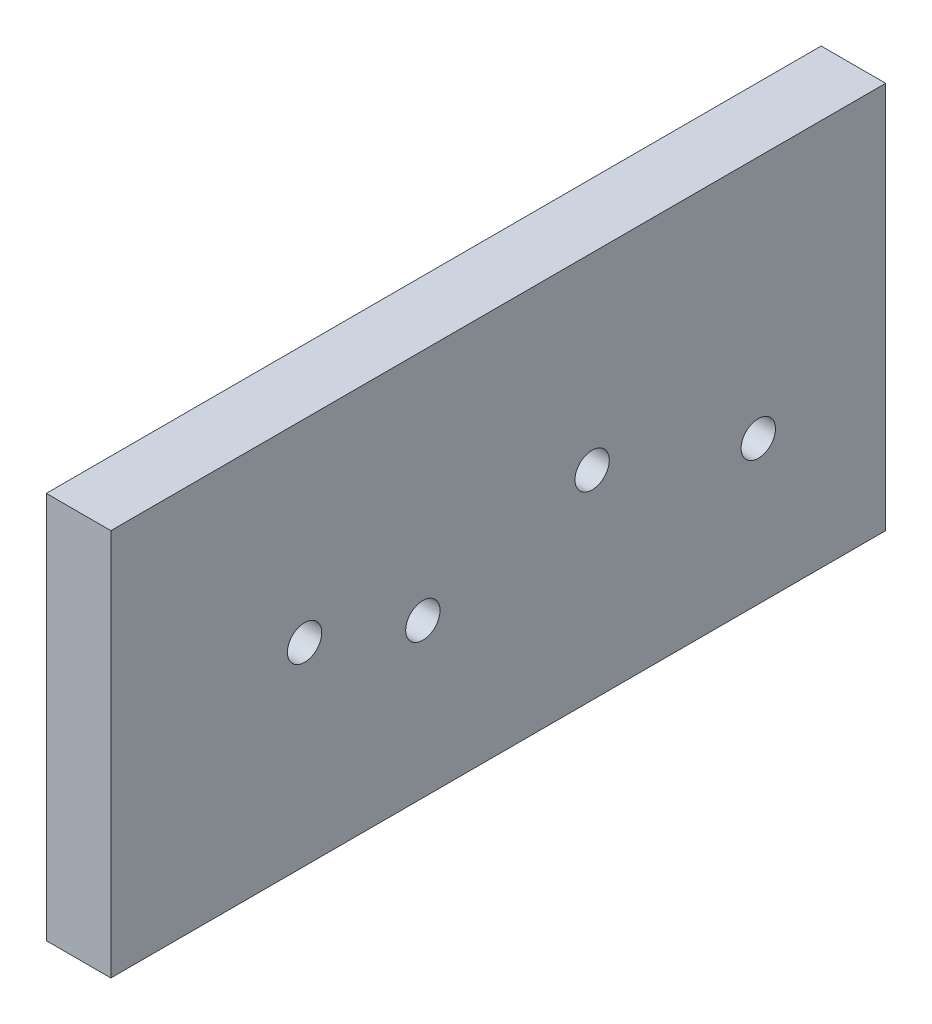
ISO-10303-21;
HEADER;
FILE_DESCRIPTION(('STEP AP214'),'2;1');
FILE_NAME('part.step','',(''),(''),'','','');
FILE_SCHEMA(('AUTOMOTIVE_DESIGN { 1 0 10303 214 1 1 1 1 }'));
ENDSEC;
DATA;
#1=APPLICATION_CONTEXT('core data for automotive mechanical design processes');
#2=APPLICATION_PROTOCOL_DEFINITION('international standard','automotive_design',2000,#1);
#3=PRODUCT_CONTEXT('',#1,'mechanical');
#4=PRODUCT('Part','Part','',(#3));
#5=PRODUCT_RELATED_PRODUCT_CATEGORY('part','',(#4));
#6=PRODUCT_DEFINITION_FORMATION('','',#4);
#7=PRODUCT_DEFINITION_CONTEXT('part definition',#1,'design');
#8=PRODUCT_DEFINITION('design','',#6,#7);
#9=PRODUCT_DEFINITION_SHAPE('','',#8);
#10=(LENGTH_UNIT() NAMED_UNIT(*) SI_UNIT(.MILLI.,.METRE.));
#11=(NAMED_UNIT(*) PLANE_ANGLE_UNIT() SI_UNIT($,.RADIAN.));
#12=(NAMED_UNIT(*) SI_UNIT($,.STERADIAN.) SOLID_ANGLE_UNIT());
#13=UNCERTAINTY_MEASURE_WITH_UNIT(LENGTH_MEASURE(1.E-05),#10,'distance_accuracy_value','');
#14=(GEOMETRIC_REPRESENTATION_CONTEXT(3) GLOBAL_UNCERTAINTY_ASSIGNED_CONTEXT((#13)) GLOBAL_UNIT_ASSIGNED_CONTEXT((#10,
#11,#12)) REPRESENTATION_CONTEXT('',''));
#15=CARTESIAN_POINT('',(0.,0.,0.));
#16=DIRECTION('',(0.,0.,1.));
#17=DIRECTION('',(1.,0.,0.));
#18=AXIS2_PLACEMENT_3D('',#15,#16,#17);
#19=CARTESIAN_POINT('',(12.7,-9.873506971,-51.1434579937716));
#20=DIRECTION('',(-1.,0.,0.));
#21=DIRECTION('',(0.,0.,1.));
#22=AXIS2_PLACEMENT_3D('',#19,#20,#21);
#23=CYLINDRICAL_SURFACE('',#22,3.3782);
#24=CARTESIAN_POINT('',(12.7,-9.873506971,-51.1434579937716));
#25=DIRECTION('',(1.,0.,0.));
#26=DIRECTION('',(0.,0.,-1.));
#27=AXIS2_PLACEMENT_3D('',#24,#25,#26);
#28=CIRCLE('',#27,3.3782);
#29=CARTESIAN_POINT('',(12.7,-9.873506971,-54.5216579937716));
#30=VERTEX_POINT('',#29);
#31=EDGE_CURVE('E115',#30,#30,#28,.T.);
#32=ORIENTED_EDGE('',*,*,#31,.T.);
#33=EDGE_LOOP('',(#32));
#34=FACE_BOUND('',#33,.T.);
#35=CARTESIAN_POINT('',(4.7625,-9.873506971,-51.1434579937716));
#36=DIRECTION('',(-1.,0.,0.));
#37=DIRECTION('',(0.,0.,1.));
#38=AXIS2_PLACEMENT_3D('',#35,#36,#37);
#39=CIRCLE('',#38,3.3782);
#40=CARTESIAN_POINT('',(4.7625,-9.873506971,-47.7652579937716));
#41=VERTEX_POINT('',#40);
#42=EDGE_CURVE('E45',#41,#41,#39,.T.);
#43=ORIENTED_EDGE('',*,*,#42,.T.);
#44=EDGE_LOOP('',(#43));
#45=FACE_BOUND('',#44,.T.);
#46=ADVANCED_FACE('F41',(#34,#45),#23,.F.);
#47=CARTESIAN_POINT('',(12.7,1.096077429,-18.4577335821185));
#48=DIRECTION('',(-1.,0.,0.));
#49=DIRECTION('',(0.,0.,1.));
#50=AXIS2_PLACEMENT_3D('',#47,#48,#49);
#51=CYLINDRICAL_SURFACE('',#50,3.3782);
#52=CARTESIAN_POINT('',(12.7,1.096077429,-18.4577335821185));
#53=DIRECTION('',(1.,0.,0.));
#54=DIRECTION('',(0.,0.,-1.));
#55=AXIS2_PLACEMENT_3D('',#52,#53,#54);
#56=CIRCLE('',#55,3.3782);
#57=CARTESIAN_POINT('',(12.7,1.096077429,-21.8359335821185));
#58=VERTEX_POINT('',#57);
#59=EDGE_CURVE('E112',#58,#58,#56,.T.);
#60=ORIENTED_EDGE('',*,*,#59,.T.);
#61=EDGE_LOOP('',(#60));
#62=FACE_BOUND('',#61,.T.);
#63=CARTESIAN_POINT('',(4.7625,1.096077429,-18.4577335821185));
#64=DIRECTION('',(-1.,0.,0.));
#65=DIRECTION('',(0.,0.,1.));
#66=AXIS2_PLACEMENT_3D('',#63,#64,#65);
#67=CIRCLE('',#66,3.3782);
#68=CARTESIAN_POINT('',(4.7625,1.096077429,-15.0795335821185));
#69=VERTEX_POINT('',#68);
#70=EDGE_CURVE('E137',#69,#69,#67,.T.);
#71=ORIENTED_EDGE('',*,*,#70,.T.);
#72=EDGE_LOOP('',(#71));
#73=FACE_BOUND('',#72,.T.);
#74=ADVANCED_FACE('F208',(#62,#73),#51,.F.);
#75=CARTESIAN_POINT('',(12.7,0.,38.1));
#76=DIRECTION('',(-1.,0.,0.));
#77=DIRECTION('',(0.,0.,1.));
#78=AXIS2_PLACEMENT_3D('',#75,#76,#77);
#79=CYLINDRICAL_SURFACE('',#78,3.3782);
#80=CARTESIAN_POINT('',(12.7,0.,38.1));
#81=DIRECTION('',(1.,0.,0.));
#82=DIRECTION('',(0.,0.,-1.));
#83=AXIS2_PLACEMENT_3D('',#80,#81,#82);
#84=CIRCLE('',#83,3.3782);
#85=CARTESIAN_POINT('',(12.7,0.,34.7218));
#86=VERTEX_POINT('',#85);
#87=EDGE_CURVE('E106',#86,#86,#84,.T.);
#88=ORIENTED_EDGE('',*,*,#87,.T.);
#89=EDGE_LOOP('',(#88));
#90=FACE_BOUND('',#89,.T.);
#91=CARTESIAN_POINT('',(4.7625,0.,38.1));
#92=DIRECTION('',(-1.,0.,0.));
#93=DIRECTION('',(0.,0.,1.));
#94=AXIS2_PLACEMENT_3D('',#91,#92,#93);
#95=CIRCLE('',#94,3.3782);
#96=CARTESIAN_POINT('',(4.7625,0.,41.4782));
#97=VERTEX_POINT('',#96);
#98=EDGE_CURVE('E134',#97,#97,#95,.T.);
#99=ORIENTED_EDGE('',*,*,#98,.T.);
#100=EDGE_LOOP('',(#99));
#101=FACE_BOUND('',#100,.T.);
#102=ADVANCED_FACE('F214',(#90,#101),#79,.F.);
#103=CARTESIAN_POINT('',(12.7,-7.860160654,14.8360220129459));
#104=DIRECTION('',(-1.,0.,0.));
#105=DIRECTION('',(0.,0.,1.));
#106=AXIS2_PLACEMENT_3D('',#103,#104,#105);
#107=CYLINDRICAL_SURFACE('',#106,3.3782);
#108=CARTESIAN_POINT('',(12.7,-7.860160654,14.8360220129459));
#109=DIRECTION('',(1.,0.,0.));
#110=DIRECTION('',(0.,0.,-1.));
#111=AXIS2_PLACEMENT_3D('',#108,#109,#110);
#112=CIRCLE('',#111,3.3782);
#113=CARTESIAN_POINT('',(12.7,-7.860160654,11.4578220129459));
#114=VERTEX_POINT('',#113);
#115=EDGE_CURVE('E118',#114,#114,#112,.T.);
#116=ORIENTED_EDGE('',*,*,#115,.T.);
#117=EDGE_LOOP('',(#116));
#118=FACE_BOUND('',#117,.T.);
#119=CARTESIAN_POINT('',(4.7625,-7.860160654,14.8360220129459));
#120=DIRECTION('',(-1.,0.,0.));
#121=DIRECTION('',(0.,0.,1.));
#122=AXIS2_PLACEMENT_3D('',#119,#120,#121);
#123=CIRCLE('',#122,3.3782);
#124=CARTESIAN_POINT('',(4.7625,-7.860160654,18.2142220129459));
#125=VERTEX_POINT('',#124);
#126=EDGE_CURVE('E131',#125,#125,#123,.T.);
#127=ORIENTED_EDGE('',*,*,#126,.T.);
#128=EDGE_LOOP('',(#127));
#129=FACE_BOUND('',#128,.T.);
#130=ADVANCED_FACE('F218',(#118,#129),#107,.F.);
#131=CARTESIAN_POINT('',(12.7,-38.1,0.));
#132=DIRECTION('',(0.,1.,0.));
#133=DIRECTION('',(0.,0.,1.));
#134=AXIS2_PLACEMENT_3D('',#131,#132,#133);
#135=PLANE('',#134);
#136=DIRECTION('',(0.,0.,-1.));
#137=VECTOR('',#136,1.);
#138=CARTESIAN_POINT('',(0.,-38.1,0.));
#139=LINE('',#138,#137);
#140=CARTESIAN_POINT('',(0.,-38.1,76.2));
#141=VERTEX_POINT('',#140);
#142=CARTESIAN_POINT('',(0.,-38.1,-76.2));
#143=VERTEX_POINT('',#142);
#144=EDGE_CURVE('E121',#141,#143,#139,.T.);
#145=ORIENTED_EDGE('',*,*,#144,.T.);
#146=DIRECTION('',(-1.,0.,0.));
#147=VECTOR('',#146,1.);
#148=CARTESIAN_POINT('',(12.7,-38.1,-76.2));
#149=LINE('',#148,#147);
#150=CARTESIAN_POINT('',(12.7,-38.1,-76.2));
#151=VERTEX_POINT('',#150);
#152=EDGE_CURVE('E11',#151,#143,#149,.T.);
#153=ORIENTED_EDGE('',*,*,#152,.F.);
#154=DIRECTION('',(0.,0.,-1.));
#155=VECTOR('',#154,1.);
#156=CARTESIAN_POINT('',(12.7,-38.1,0.));
#157=LINE('',#156,#155);
#158=CARTESIAN_POINT('',(12.7,-38.1,76.2));
#159=VERTEX_POINT('',#158);
#160=EDGE_CURVE('E94',#159,#151,#157,.T.);
#161=ORIENTED_EDGE('',*,*,#160,.F.);
#162=DIRECTION('',(-1.,0.,0.));
#163=VECTOR('',#162,1.);
#164=CARTESIAN_POINT('',(12.7,-38.1,76.2));
#165=LINE('',#164,#163);
#166=EDGE_CURVE('E60',#159,#141,#165,.T.);
#167=ORIENTED_EDGE('',*,*,#166,.T.);
#168=EDGE_LOOP('',(#145,#153,#161,#167));
#169=FACE_BOUND('',#168,.T.);
#170=ADVANCED_FACE('F43',(#169),#135,.F.);
#171=CARTESIAN_POINT('',(12.7,0.,-76.2));
#172=DIRECTION('',(0.,0.,1.));
#173=DIRECTION('',(1.,0.,0.));
#174=AXIS2_PLACEMENT_3D('',#171,#172,#173);
#175=PLANE('',#174);
#176=DIRECTION('',(0.,1.,0.));
#177=VECTOR('',#176,1.);
#178=CARTESIAN_POINT('',(0.,0.,-76.2));
#179=LINE('',#178,#177);
#180=CARTESIAN_POINT('',(0.,38.1,-76.2));
#181=VERTEX_POINT('',#180);
#182=EDGE_CURVE('E99',#143,#181,#179,.T.);
#183=ORIENTED_EDGE('',*,*,#182,.T.);
#184=DIRECTION('',(-1.,0.,0.));
#185=VECTOR('',#184,1.);
#186=CARTESIAN_POINT('',(12.7,38.1,-76.2));
#187=LINE('',#186,#185);
#188=CARTESIAN_POINT('',(12.7,38.1,-76.2));
#189=VERTEX_POINT('',#188);
#190=EDGE_CURVE('E51',#189,#181,#187,.T.);
#191=ORIENTED_EDGE('',*,*,#190,.F.);
#192=DIRECTION('',(0.,1.,0.));
#193=VECTOR('',#192,1.);
#194=CARTESIAN_POINT('',(12.7,0.,-76.2));
#195=LINE('',#194,#193);
#196=EDGE_CURVE('E85',#151,#189,#195,.T.);
#197=ORIENTED_EDGE('',*,*,#196,.F.);
#198=ORIENTED_EDGE('',*,*,#152,.T.);
#199=EDGE_LOOP('',(#183,#191,#197,#198));
#200=FACE_BOUND('',#199,.T.);
#201=ADVANCED_FACE('F98',(#200),#175,.F.);
#202=CARTESIAN_POINT('',(12.7,38.1,0.));
#203=DIRECTION('',(0.,1.,0.));
#204=DIRECTION('',(0.,0.,1.));
#205=AXIS2_PLACEMENT_3D('',#202,#203,#204);
#206=PLANE('',#205);
#207=DIRECTION('',(0.,0.,-1.));
#208=VECTOR('',#207,1.);
#209=CARTESIAN_POINT('',(0.,38.1,0.));
#210=LINE('',#209,#208);
#211=CARTESIAN_POINT('',(0.,38.1,76.2));
#212=VERTEX_POINT('',#211);
#213=EDGE_CURVE('E124',#212,#181,#210,.T.);
#214=ORIENTED_EDGE('',*,*,#213,.F.);
#215=DIRECTION('',(-1.,0.,0.));
#216=VECTOR('',#215,1.);
#217=CARTESIAN_POINT('',(12.7,38.1,76.2));
#218=LINE('',#217,#216);
#219=CARTESIAN_POINT('',(12.7,38.1,76.2));
#220=VERTEX_POINT('',#219);
#221=EDGE_CURVE('E74',#220,#212,#218,.T.);
#222=ORIENTED_EDGE('',*,*,#221,.F.);
#223=DIRECTION('',(0.,0.,-1.));
#224=VECTOR('',#223,1.);
#225=CARTESIAN_POINT('',(12.7,38.1,0.));
#226=LINE('',#225,#224);
#227=EDGE_CURVE('E93',#220,#189,#226,.T.);
#228=ORIENTED_EDGE('',*,*,#227,.T.);
#229=ORIENTED_EDGE('',*,*,#190,.T.);
#230=EDGE_LOOP('',(#214,#222,#228,#229));
#231=FACE_BOUND('',#230,.T.);
#232=ADVANCED_FACE('F103',(#231),#206,.T.);
#233=CARTESIAN_POINT('',(12.7,0.,76.2));
#234=DIRECTION('',(0.,0.,1.));
#235=DIRECTION('',(1.,0.,0.));
#236=AXIS2_PLACEMENT_3D('',#233,#234,#235);
#237=PLANE('',#236);
#238=DIRECTION('',(0.,1.,0.));
#239=VECTOR('',#238,1.);
#240=CARTESIAN_POINT('',(0.,0.,76.2));
#241=LINE('',#240,#239);
#242=EDGE_CURVE('E126',#141,#212,#241,.T.);
#243=ORIENTED_EDGE('',*,*,#242,.F.);
#244=ORIENTED_EDGE('',*,*,#166,.F.);
#245=DIRECTION('',(0.,1.,0.));
#246=VECTOR('',#245,1.);
#247=CARTESIAN_POINT('',(12.7,0.,76.2));
#248=LINE('',#247,#246);
#249=EDGE_CURVE('E104',#159,#220,#248,.T.);
#250=ORIENTED_EDGE('',*,*,#249,.T.);
#251=ORIENTED_EDGE('',*,*,#221,.T.);
#252=EDGE_LOOP('',(#243,#244,#250,#251));
#253=FACE_BOUND('',#252,.T.);
#254=ADVANCED_FACE('F197',(#253),#237,.T.);
#255=CARTESIAN_POINT('',(12.7,0.,0.));
#256=DIRECTION('',(1.,0.,0.));
#257=DIRECTION('',(0.,0.,-1.));
#258=AXIS2_PLACEMENT_3D('',#255,#256,#257);
#259=PLANE('',#258);
#260=ORIENTED_EDGE('',*,*,#160,.T.);
#261=ORIENTED_EDGE('',*,*,#196,.T.);
#262=ORIENTED_EDGE('',*,*,#227,.F.);
#263=ORIENTED_EDGE('',*,*,#249,.F.);
#264=EDGE_LOOP('',(#260,#261,#262,#263));
#265=FACE_BOUND('',#264,.T.);
#266=ORIENTED_EDGE('',*,*,#87,.F.);
#267=EDGE_LOOP('',(#266));
#268=FACE_BOUND('',#267,.T.);
#269=ORIENTED_EDGE('',*,*,#59,.F.);
#270=EDGE_LOOP('',(#269));
#271=FACE_BOUND('',#270,.T.);
#272=ORIENTED_EDGE('',*,*,#31,.F.);
#273=EDGE_LOOP('',(#272));
#274=FACE_BOUND('',#273,.T.);
#275=ORIENTED_EDGE('',*,*,#115,.F.);
#276=EDGE_LOOP('',(#275));
#277=FACE_BOUND('',#276,.T.);
#278=ADVANCED_FACE('F89',(#265,#268,#271,#274,#277),#259,.T.);
#279=CARTESIAN_POINT('',(0.,0.,0.));
#280=DIRECTION('',(1.,0.,0.));
#281=DIRECTION('',(0.,0.,-1.));
#282=AXIS2_PLACEMENT_3D('',#279,#280,#281);
#283=PLANE('',#282);
#284=CARTESIAN_POINT('',(0.,0.,38.1));
#285=DIRECTION('',(-1.,0.,0.));
#286=DIRECTION('',(0.,0.,1.));
#287=AXIS2_PLACEMENT_3D('',#284,#285,#286);
#288=CIRCLE('',#287,6.223);
#289=CARTESIAN_POINT('',(0.,0.,44.323));
#290=VERTEX_POINT('',#289);
#291=EDGE_CURVE('E172',#290,#290,#288,.T.);
#292=ORIENTED_EDGE('',*,*,#291,.F.);
#293=EDGE_LOOP('',(#292));
#294=FACE_BOUND('',#293,.T.);
#295=CARTESIAN_POINT('',(0.,-7.860160654,14.8360220129459));
#296=DIRECTION('',(-1.,0.,0.));
#297=DIRECTION('',(0.,0.,1.));
#298=AXIS2_PLACEMENT_3D('',#295,#296,#297);
#299=CIRCLE('',#298,6.223);
#300=CARTESIAN_POINT('',(0.,-7.860160654,21.0590220129459));
#301=VERTEX_POINT('',#300);
#302=EDGE_CURVE('E169',#301,#301,#299,.T.);
#303=ORIENTED_EDGE('',*,*,#302,.F.);
#304=EDGE_LOOP('',(#303));
#305=FACE_BOUND('',#304,.T.);
#306=CARTESIAN_POINT('',(0.,1.096077429,-18.4577335821185));
#307=DIRECTION('',(-1.,0.,0.));
#308=DIRECTION('',(0.,0.,1.));
#309=AXIS2_PLACEMENT_3D('',#306,#307,#308);
#310=CIRCLE('',#309,6.223);
#311=CARTESIAN_POINT('',(0.,1.096077429,-12.2347335821185));
#312=VERTEX_POINT('',#311);
#313=EDGE_CURVE('E163',#312,#312,#310,.T.);
#314=ORIENTED_EDGE('',*,*,#313,.F.);
#315=EDGE_LOOP('',(#314));
#316=FACE_BOUND('',#315,.T.);
#317=CARTESIAN_POINT('',(0.,-9.873506971,-51.1434579937716));
#318=DIRECTION('',(-1.,0.,0.));
#319=DIRECTION('',(0.,0.,1.));
#320=AXIS2_PLACEMENT_3D('',#317,#318,#319);
#321=CIRCLE('',#320,6.223);
#322=CARTESIAN_POINT('',(0.,-9.873506971,-44.9204579937716));
#323=VERTEX_POINT('',#322);
#324=EDGE_CURVE('E155',#323,#323,#321,.T.);
#325=ORIENTED_EDGE('',*,*,#324,.F.);
#326=EDGE_LOOP('',(#325));
#327=FACE_BOUND('',#326,.T.);
#328=ORIENTED_EDGE('',*,*,#144,.F.);
#329=ORIENTED_EDGE('',*,*,#242,.T.);
#330=ORIENTED_EDGE('',*,*,#213,.T.);
#331=ORIENTED_EDGE('',*,*,#182,.F.);
#332=EDGE_LOOP('',(#328,#329,#330,#331));
#333=FACE_BOUND('',#332,.T.);
#334=ADVANCED_FACE('F187',(#294,#305,#316,#327,#333),#283,.F.);
#335=CARTESIAN_POINT('',(4.7625,-9.873506971,-51.1434579937716));
#336=DIRECTION('',(-1.,0.,0.));
#337=DIRECTION('',(0.,0.,1.));
#338=AXIS2_PLACEMENT_3D('',#335,#336,#337);
#339=CYLINDRICAL_SURFACE('',#338,6.223);
#340=CARTESIAN_POINT('',(4.7625,-9.873506971,-51.1434579937716));
#341=DIRECTION('',(-1.,0.,0.));
#342=DIRECTION('',(0.,0.,1.));
#343=AXIS2_PLACEMENT_3D('',#340,#341,#342);
#344=CIRCLE('',#343,6.223);
#345=CARTESIAN_POINT('',(4.7625,-9.873506971,-44.9204579937716));
#346=VERTEX_POINT('',#345);
#347=EDGE_CURVE('E153',#346,#346,#344,.T.);
#348=CARTESIAN_POINT('',(4.7625,-9.873506971,-44.9204579937716));
#349=CARTESIAN_POINT('',(4.712890625,-9.873506971,-44.9204579937716));
#350=CARTESIAN_POINT('',(4.66328125,-9.873506971,-44.9204579937716));
#351=CARTESIAN_POINT('',(4.5640625,-9.873506971,-44.9204579937716));
#352=CARTESIAN_POINT('',(4.514453125,-9.873506971,-44.9204579937716));
#353=CARTESIAN_POINT('',(4.415234375,-9.873506971,-44.9204579937716));
#354=CARTESIAN_POINT('',(4.365625,-9.873506971,-44.9204579937716));
#355=CARTESIAN_POINT('',(4.26640625,-9.873506971,-44.9204579937716));
#356=CARTESIAN_POINT('',(4.216796875,-9.873506971,-44.9204579937716));
#357=CARTESIAN_POINT('',(4.117578125,-9.873506971,-44.9204579937716));
#358=CARTESIAN_POINT('',(4.06796875,-9.873506971,-44.9204579937716));
#359=CARTESIAN_POINT('',(3.96875,-9.873506971,-44.9204579937716));
#360=CARTESIAN_POINT('',(3.919140625,-9.873506971,-44.9204579937716));
#361=CARTESIAN_POINT('',(3.819921875,-9.873506971,-44.9204579937716));
#362=CARTESIAN_POINT('',(3.7703125,-9.873506971,-44.9204579937716));
#363=CARTESIAN_POINT('',(3.67109375,-9.873506971,-44.9204579937716));
#364=CARTESIAN_POINT('',(3.621484375,-9.873506971,-44.9204579937716));
#365=CARTESIAN_POINT('',(3.522265625,-9.873506971,-44.9204579937716));
#366=CARTESIAN_POINT('',(3.47265625,-9.873506971,-44.9204579937716));
#367=CARTESIAN_POINT('',(3.3734375,-9.873506971,-44.9204579937716));
#368=CARTESIAN_POINT('',(3.323828125,-9.873506971,-44.9204579937716));
#369=CARTESIAN_POINT('',(3.224609375,-9.873506971,-44.9204579937716));
#370=CARTESIAN_POINT('',(3.175,-9.873506971,-44.9204579937716));
#371=CARTESIAN_POINT('',(3.07578125,-9.873506971,-44.9204579937716));
#372=CARTESIAN_POINT('',(3.026171875,-9.873506971,-44.9204579937716));
#373=CARTESIAN_POINT('',(2.926953125,-9.873506971,-44.9204579937716));
#374=CARTESIAN_POINT('',(2.87734375,-9.873506971,-44.9204579937716));
#375=CARTESIAN_POINT('',(2.778125,-9.873506971,-44.9204579937716));
#376=CARTESIAN_POINT('',(2.728515625,-9.873506971,-44.9204579937716));
#377=CARTESIAN_POINT('',(2.629296875,-9.873506971,-44.9204579937716));
#378=CARTESIAN_POINT('',(2.5796875,-9.873506971,-44.9204579937716));
#379=CARTESIAN_POINT('',(2.48046875,-9.873506971,-44.9204579937716));
#380=CARTESIAN_POINT('',(2.430859375,-9.873506971,-44.9204579937716));
#381=CARTESIAN_POINT('',(2.331640625,-9.873506971,-44.9204579937716));
#382=CARTESIAN_POINT('',(2.28203125,-9.873506971,-44.9204579937716));
#383=CARTESIAN_POINT('',(2.1828125,-9.873506971,-44.9204579937716));
#384=CARTESIAN_POINT('',(2.133203125,-9.873506971,-44.9204579937716));
#385=CARTESIAN_POINT('',(2.033984375,-9.873506971,-44.9204579937716));
#386=CARTESIAN_POINT('',(1.984375,-9.873506971,-44.9204579937716));
#387=CARTESIAN_POINT('',(1.88515625,-9.873506971,-44.9204579937716));
#388=CARTESIAN_POINT('',(1.835546875,-9.873506971,-44.9204579937716));
#389=CARTESIAN_POINT('',(1.736328125,-9.873506971,-44.9204579937716));
#390=CARTESIAN_POINT('',(1.68671875,-9.873506971,-44.9204579937716));
#391=CARTESIAN_POINT('',(1.5875,-9.873506971,-44.9204579937716));
#392=CARTESIAN_POINT('',(1.537890625,-9.873506971,-44.9204579937716));
#393=CARTESIAN_POINT('',(1.438671875,-9.873506971,-44.9204579937716));
#394=CARTESIAN_POINT('',(1.3890625,-9.873506971,-44.9204579937716));
#395=CARTESIAN_POINT('',(1.28984375,-9.873506971,-44.9204579937716));
#396=CARTESIAN_POINT('',(1.240234375,-9.873506971,-44.9204579937716));
#397=CARTESIAN_POINT('',(1.141015625,-9.873506971,-44.9204579937716));
#398=CARTESIAN_POINT('',(1.09140625,-9.873506971,-44.9204579937716));
#399=CARTESIAN_POINT('',(0.9921875,-9.873506971,-44.9204579937716));
#400=CARTESIAN_POINT('',(0.942578125,-9.873506971,-44.9204579937716));
#401=CARTESIAN_POINT('',(0.843359375,-9.873506971,-44.9204579937716));
#402=CARTESIAN_POINT('',(0.79375,-9.873506971,-44.9204579937716));
#403=CARTESIAN_POINT('',(0.69453125,-9.873506971,-44.9204579937716));
#404=CARTESIAN_POINT('',(0.644921875,-9.873506971,-44.9204579937716));
#405=CARTESIAN_POINT('',(0.545703125,-9.873506971,-44.9204579937716));
#406=CARTESIAN_POINT('',(0.49609375,-9.873506971,-44.9204579937716));
#407=CARTESIAN_POINT('',(0.396875,-9.873506971,-44.9204579937716));
#408=CARTESIAN_POINT('',(0.347265625,-9.873506971,-44.9204579937716));
#409=CARTESIAN_POINT('',(0.248046875,-9.873506971,-44.9204579937716));
#410=CARTESIAN_POINT('',(0.1984375,-9.873506971,-44.9204579937716));
#411=CARTESIAN_POINT('',(0.09921875,-9.873506971,-44.9204579937716));
#412=CARTESIAN_POINT('',(0.049609375,-9.873506971,-44.9204579937716));
#413=CARTESIAN_POINT('',(0.,-9.873506971,-44.9204579937716));
#414=B_SPLINE_CURVE_WITH_KNOTS('',3,(#348,#349,#350,#351,#352,#353,#354,#355,#356,#357,#358,
#359,#360,#361,#362,#363,#364,#365,#366,#367,#368,#369,#370,#371,#372,#373,#374,#375,#376,#377,
#378,#379,#380,#381,#382,#383,#384,#385,#386,#387,#388,#389,#390,#391,#392,#393,#394,#395,#396,
#397,#398,#399,#400,#401,#402,#403,#404,#405,#406,#407,#408,#409,#410,#411,#412,#413),
.UNSPECIFIED.,.F.,.F.,(4,2,2,2,2,2,2,2,2,2,2,2,2,2,2,2,2,2,2,2,2,2,2,2,2,2,2,2,2,2,2,2,4),(0.,
0.148828125,0.29765625,0.446484375,0.5953125,0.744140625,0.892968750000001,1.041796875,1.190625,
1.339453125,1.48828125,1.637109375,1.7859375,1.934765625,2.08359375,2.232421875,2.38125,
2.530078125,2.67890625,2.827734375,2.9765625,3.125390625,3.27421875,3.423046875,3.571875,
3.720703125,3.86953125,4.018359375,4.1671875,4.316015625,4.46484375,4.613671875,4.7625),.UNSPECIFIED.);
#415=EDGE_CURVE('BSEAM149',#346,#323,#414,.T.);
#416=ORIENTED_EDGE('',*,*,#347,.F.);
#417=ORIENTED_EDGE('',*,*,#324,.T.);
#418=ORIENTED_EDGE('',*,*,#415,.T.);
#419=ORIENTED_EDGE('',*,*,#415,.F.);
#420=EDGE_LOOP('',(#416,#418,#417,#419));
#421=FACE_BOUND('',#420,.T.);
#422=ADVANCED_FACE('F149',(#421),#339,.F.);
#423=CARTESIAN_POINT('',(4.7625,-9.873506971,-51.1434579937716));
#424=DIRECTION('',(-1.,0.,0.));
#425=DIRECTION('',(0.,0.,1.));
#426=AXIS2_PLACEMENT_3D('',#423,#424,#425);
#427=PLANE('',#426);
#428=ORIENTED_EDGE('',*,*,#42,.F.);
#429=EDGE_LOOP('',(#428));
#430=FACE_BOUND('',#429,.T.);
#431=ORIENTED_EDGE('',*,*,#347,.T.);
#432=EDGE_LOOP('',(#431));
#433=FACE_BOUND('',#432,.T.);
#434=ADVANCED_FACE('F145',(#430,#433),#427,.T.);
#435=CARTESIAN_POINT('',(4.7625,1.096077429,-18.4577335821185));
#436=DIRECTION('',(-1.,0.,0.));
#437=DIRECTION('',(0.,0.,1.));
#438=AXIS2_PLACEMENT_3D('',#435,#436,#437);
#439=CYLINDRICAL_SURFACE('',#438,6.223);
#440=CARTESIAN_POINT('',(4.7625,1.096077429,-18.4577335821185));
#441=DIRECTION('',(-1.,0.,0.));
#442=DIRECTION('',(0.,0.,1.));
#443=AXIS2_PLACEMENT_3D('',#440,#441,#442);
#444=CIRCLE('',#443,6.223);
#445=CARTESIAN_POINT('',(4.7625,1.096077429,-12.2347335821185));
#446=VERTEX_POINT('',#445);
#447=EDGE_CURVE('E158',#446,#446,#444,.T.);
#448=CARTESIAN_POINT('',(4.7625,1.096077429,-12.2347335821185));
#449=CARTESIAN_POINT('',(4.712890625,1.096077429,-12.2347335821185));
#450=CARTESIAN_POINT('',(4.66328125,1.096077429,-12.2347335821185));
#451=CARTESIAN_POINT('',(4.5640625,1.096077429,-12.2347335821185));
#452=CARTESIAN_POINT('',(4.514453125,1.096077429,-12.2347335821185));
#453=CARTESIAN_POINT('',(4.415234375,1.096077429,-12.2347335821185));
#454=CARTESIAN_POINT('',(4.365625,1.096077429,-12.2347335821185));
#455=CARTESIAN_POINT('',(4.26640625,1.096077429,-12.2347335821185));
#456=CARTESIAN_POINT('',(4.216796875,1.096077429,-12.2347335821185));
#457=CARTESIAN_POINT('',(4.117578125,1.096077429,-12.2347335821185));
#458=CARTESIAN_POINT('',(4.06796875,1.096077429,-12.2347335821185));
#459=CARTESIAN_POINT('',(3.96875,1.096077429,-12.2347335821185));
#460=CARTESIAN_POINT('',(3.919140625,1.096077429,-12.2347335821185));
#461=CARTESIAN_POINT('',(3.819921875,1.096077429,-12.2347335821185));
#462=CARTESIAN_POINT('',(3.7703125,1.096077429,-12.2347335821185));
#463=CARTESIAN_POINT('',(3.67109375,1.096077429,-12.2347335821185));
#464=CARTESIAN_POINT('',(3.621484375,1.096077429,-12.2347335821185));
#465=CARTESIAN_POINT('',(3.522265625,1.096077429,-12.2347335821185));
#466=CARTESIAN_POINT('',(3.47265625,1.096077429,-12.2347335821185));
#467=CARTESIAN_POINT('',(3.3734375,1.096077429,-12.2347335821185));
#468=CARTESIAN_POINT('',(3.323828125,1.096077429,-12.2347335821185));
#469=CARTESIAN_POINT('',(3.224609375,1.096077429,-12.2347335821185));
#470=CARTESIAN_POINT('',(3.175,1.096077429,-12.2347335821185));
#471=CARTESIAN_POINT('',(3.07578125,1.096077429,-12.2347335821185));
#472=CARTESIAN_POINT('',(3.026171875,1.096077429,-12.2347335821185));
#473=CARTESIAN_POINT('',(2.926953125,1.096077429,-12.2347335821185));
#474=CARTESIAN_POINT('',(2.87734375,1.096077429,-12.2347335821185));
#475=CARTESIAN_POINT('',(2.778125,1.096077429,-12.2347335821185));
#476=CARTESIAN_POINT('',(2.728515625,1.096077429,-12.2347335821185));
#477=CARTESIAN_POINT('',(2.629296875,1.096077429,-12.2347335821185));
#478=CARTESIAN_POINT('',(2.5796875,1.096077429,-12.2347335821185));
#479=CARTESIAN_POINT('',(2.48046875,1.096077429,-12.2347335821185));
#480=CARTESIAN_POINT('',(2.430859375,1.096077429,-12.2347335821185));
#481=CARTESIAN_POINT('',(2.331640625,1.096077429,-12.2347335821185));
#482=CARTESIAN_POINT('',(2.28203125,1.096077429,-12.2347335821185));
#483=CARTESIAN_POINT('',(2.1828125,1.096077429,-12.2347335821185));
#484=CARTESIAN_POINT('',(2.133203125,1.096077429,-12.2347335821185));
#485=CARTESIAN_POINT('',(2.033984375,1.096077429,-12.2347335821185));
#486=CARTESIAN_POINT('',(1.984375,1.096077429,-12.2347335821185));
#487=CARTESIAN_POINT('',(1.88515625,1.096077429,-12.2347335821185));
#488=CARTESIAN_POINT('',(1.835546875,1.096077429,-12.2347335821185));
#489=CARTESIAN_POINT('',(1.736328125,1.096077429,-12.2347335821185));
#490=CARTESIAN_POINT('',(1.68671875,1.096077429,-12.2347335821185));
#491=CARTESIAN_POINT('',(1.5875,1.096077429,-12.2347335821185));
#492=CARTESIAN_POINT('',(1.537890625,1.096077429,-12.2347335821185));
#493=CARTESIAN_POINT('',(1.438671875,1.096077429,-12.2347335821185));
#494=CARTESIAN_POINT('',(1.3890625,1.096077429,-12.2347335821185));
#495=CARTESIAN_POINT('',(1.28984375,1.096077429,-12.2347335821185));
#496=CARTESIAN_POINT('',(1.240234375,1.096077429,-12.2347335821185));
#497=CARTESIAN_POINT('',(1.141015625,1.096077429,-12.2347335821185));
#498=CARTESIAN_POINT('',(1.09140625,1.096077429,-12.2347335821185));
#499=CARTESIAN_POINT('',(0.9921875,1.096077429,-12.2347335821185));
#500=CARTESIAN_POINT('',(0.942578125,1.096077429,-12.2347335821185));
#501=CARTESIAN_POINT('',(0.843359375,1.096077429,-12.2347335821185));
#502=CARTESIAN_POINT('',(0.79375,1.096077429,-12.2347335821185));
#503=CARTESIAN_POINT('',(0.69453125,1.096077429,-12.2347335821185));
#504=CARTESIAN_POINT('',(0.644921875,1.096077429,-12.2347335821185));
#505=CARTESIAN_POINT('',(0.545703125,1.096077429,-12.2347335821185));
#506=CARTESIAN_POINT('',(0.49609375,1.096077429,-12.2347335821185));
#507=CARTESIAN_POINT('',(0.396875,1.096077429,-12.2347335821185));
#508=CARTESIAN_POINT('',(0.347265625,1.096077429,-12.2347335821185));
#509=CARTESIAN_POINT('',(0.248046875,1.096077429,-12.2347335821185));
#510=CARTESIAN_POINT('',(0.1984375,1.096077429,-12.2347335821185));
#511=CARTESIAN_POINT('',(0.09921875,1.096077429,-12.2347335821185));
#512=CARTESIAN_POINT('',(0.049609375,1.096077429,-12.2347335821185));
#513=CARTESIAN_POINT('',(0.,1.096077429,-12.2347335821185));
#514=B_SPLINE_CURVE_WITH_KNOTS('',3,(#448,#449,#450,#451,#452,#453,#454,#455,#456,#457,#458,
#459,#460,#461,#462,#463,#464,#465,#466,#467,#468,#469,#470,#471,#472,#473,#474,#475,#476,#477,
#478,#479,#480,#481,#482,#483,#484,#485,#486,#487,#488,#489,#490,#491,#492,#493,#494,#495,#496,
#497,#498,#499,#500,#501,#502,#503,#504,#505,#506,#507,#508,#509,#510,#511,#512,#513),
.UNSPECIFIED.,.F.,.F.,(4,2,2,2,2,2,2,2,2,2,2,2,2,2,2,2,2,2,2,2,2,2,2,2,2,2,2,2,2,2,2,2,4),(0.,
0.148828125,0.29765625,0.446484375,0.5953125,0.744140625,0.892968750000001,1.041796875,1.190625,
1.339453125,1.48828125,1.637109375,1.7859375,1.934765625,2.08359375,2.232421875,2.38125,
2.530078125,2.67890625,2.827734375,2.9765625,3.125390625,3.27421875,3.423046875,3.571875,
3.720703125,3.86953125,4.018359375,4.1671875,4.316015625,4.46484375,4.613671875,4.7625),.UNSPECIFIED.);
#515=EDGE_CURVE('BSEAM148',#446,#312,#514,.T.);
#516=ORIENTED_EDGE('',*,*,#447,.F.);
#517=ORIENTED_EDGE('',*,*,#313,.T.);
#518=ORIENTED_EDGE('',*,*,#515,.T.);
#519=ORIENTED_EDGE('',*,*,#515,.F.);
#520=EDGE_LOOP('',(#516,#518,#517,#519));
#521=FACE_BOUND('',#520,.T.);
#522=ADVANCED_FACE('F148',(#521),#439,.F.);
#523=CARTESIAN_POINT('',(4.7625,1.096077429,-18.4577335821185));
#524=DIRECTION('',(-1.,0.,0.));
#525=DIRECTION('',(0.,0.,1.));
#526=AXIS2_PLACEMENT_3D('',#523,#524,#525);
#527=PLANE('',#526);
#528=ORIENTED_EDGE('',*,*,#70,.F.);
#529=EDGE_LOOP('',(#528));
#530=FACE_BOUND('',#529,.T.);
#531=ORIENTED_EDGE('',*,*,#447,.T.);
#532=EDGE_LOOP('',(#531));
#533=FACE_BOUND('',#532,.T.);
#534=ADVANCED_FACE('F237',(#530,#533),#527,.T.);
#535=CARTESIAN_POINT('',(4.7625,-7.860160654,14.8360220129459));
#536=DIRECTION('',(-1.,0.,0.));
#537=DIRECTION('',(0.,0.,1.));
#538=AXIS2_PLACEMENT_3D('',#535,#536,#537);
#539=CYLINDRICAL_SURFACE('',#538,6.223);
#540=CARTESIAN_POINT('',(4.7625,-7.860160654,14.8360220129459));
#541=DIRECTION('',(-1.,0.,0.));
#542=DIRECTION('',(0.,0.,1.));
#543=AXIS2_PLACEMENT_3D('',#540,#541,#542);
#544=CIRCLE('',#543,6.223);
#545=CARTESIAN_POINT('',(4.7625,-7.860160654,21.0590220129459));
#546=VERTEX_POINT('',#545);
#547=EDGE_CURVE('E166',#546,#546,#544,.T.);
#548=CARTESIAN_POINT('',(4.7625,-7.860160654,21.0590220129459));
#549=CARTESIAN_POINT('',(4.712890625,-7.860160654,21.0590220129459));
#550=CARTESIAN_POINT('',(4.66328125,-7.860160654,21.0590220129459));
#551=CARTESIAN_POINT('',(4.5640625,-7.860160654,21.0590220129459));
#552=CARTESIAN_POINT('',(4.514453125,-7.860160654,21.0590220129459));
#553=CARTESIAN_POINT('',(4.415234375,-7.860160654,21.0590220129459));
#554=CARTESIAN_POINT('',(4.365625,-7.860160654,21.0590220129459));
#555=CARTESIAN_POINT('',(4.26640625,-7.860160654,21.0590220129459));
#556=CARTESIAN_POINT('',(4.216796875,-7.860160654,21.0590220129459));
#557=CARTESIAN_POINT('',(4.117578125,-7.860160654,21.0590220129459));
#558=CARTESIAN_POINT('',(4.06796875,-7.860160654,21.0590220129459));
#559=CARTESIAN_POINT('',(3.96875,-7.860160654,21.0590220129459));
#560=CARTESIAN_POINT('',(3.919140625,-7.860160654,21.0590220129459));
#561=CARTESIAN_POINT('',(3.819921875,-7.860160654,21.0590220129459));
#562=CARTESIAN_POINT('',(3.7703125,-7.860160654,21.0590220129459));
#563=CARTESIAN_POINT('',(3.67109375,-7.860160654,21.0590220129459));
#564=CARTESIAN_POINT('',(3.621484375,-7.860160654,21.0590220129459));
#565=CARTESIAN_POINT('',(3.522265625,-7.860160654,21.0590220129459));
#566=CARTESIAN_POINT('',(3.47265625,-7.860160654,21.0590220129459));
#567=CARTESIAN_POINT('',(3.3734375,-7.860160654,21.0590220129459));
#568=CARTESIAN_POINT('',(3.323828125,-7.860160654,21.0590220129459));
#569=CARTESIAN_POINT('',(3.224609375,-7.860160654,21.0590220129459));
#570=CARTESIAN_POINT('',(3.175,-7.860160654,21.0590220129459));
#571=CARTESIAN_POINT('',(3.07578125,-7.860160654,21.0590220129459));
#572=CARTESIAN_POINT('',(3.026171875,-7.860160654,21.0590220129459));
#573=CARTESIAN_POINT('',(2.926953125,-7.860160654,21.0590220129459));
#574=CARTESIAN_POINT('',(2.87734375,-7.860160654,21.0590220129459));
#575=CARTESIAN_POINT('',(2.778125,-7.860160654,21.0590220129459));
#576=CARTESIAN_POINT('',(2.728515625,-7.860160654,21.0590220129459));
#577=CARTESIAN_POINT('',(2.629296875,-7.860160654,21.0590220129459));
#578=CARTESIAN_POINT('',(2.5796875,-7.860160654,21.0590220129459));
#579=CARTESIAN_POINT('',(2.48046875,-7.860160654,21.0590220129459));
#580=CARTESIAN_POINT('',(2.430859375,-7.860160654,21.0590220129459));
#581=CARTESIAN_POINT('',(2.331640625,-7.860160654,21.0590220129459));
#582=CARTESIAN_POINT('',(2.28203125,-7.860160654,21.0590220129459));
#583=CARTESIAN_POINT('',(2.1828125,-7.860160654,21.0590220129459));
#584=CARTESIAN_POINT('',(2.133203125,-7.860160654,21.0590220129459));
#585=CARTESIAN_POINT('',(2.033984375,-7.860160654,21.0590220129459));
#586=CARTESIAN_POINT('',(1.984375,-7.860160654,21.0590220129459));
#587=CARTESIAN_POINT('',(1.88515625,-7.860160654,21.0590220129459));
#588=CARTESIAN_POINT('',(1.835546875,-7.860160654,21.0590220129459));
#589=CARTESIAN_POINT('',(1.736328125,-7.860160654,21.0590220129459));
#590=CARTESIAN_POINT('',(1.68671875,-7.860160654,21.0590220129459));
#591=CARTESIAN_POINT('',(1.5875,-7.860160654,21.0590220129459));
#592=CARTESIAN_POINT('',(1.537890625,-7.860160654,21.0590220129459));
#593=CARTESIAN_POINT('',(1.438671875,-7.860160654,21.0590220129459));
#594=CARTESIAN_POINT('',(1.3890625,-7.860160654,21.0590220129459));
#595=CARTESIAN_POINT('',(1.28984375,-7.860160654,21.0590220129459));
#596=CARTESIAN_POINT('',(1.240234375,-7.860160654,21.0590220129459));
#597=CARTESIAN_POINT('',(1.141015625,-7.860160654,21.0590220129459));
#598=CARTESIAN_POINT('',(1.09140625,-7.860160654,21.0590220129459));
#599=CARTESIAN_POINT('',(0.9921875,-7.860160654,21.0590220129459));
#600=CARTESIAN_POINT('',(0.942578125,-7.860160654,21.0590220129459));
#601=CARTESIAN_POINT('',(0.843359375,-7.860160654,21.0590220129459));
#602=CARTESIAN_POINT('',(0.79375,-7.860160654,21.0590220129459));
#603=CARTESIAN_POINT('',(0.69453125,-7.860160654,21.0590220129459));
#604=CARTESIAN_POINT('',(0.644921875,-7.860160654,21.0590220129459));
#605=CARTESIAN_POINT('',(0.545703125,-7.860160654,21.0590220129459));
#606=CARTESIAN_POINT('',(0.49609375,-7.860160654,21.0590220129459));
#607=CARTESIAN_POINT('',(0.396875,-7.860160654,21.0590220129459));
#608=CARTESIAN_POINT('',(0.347265625,-7.860160654,21.0590220129459));
#609=CARTESIAN_POINT('',(0.248046875,-7.860160654,21.0590220129459));
#610=CARTESIAN_POINT('',(0.1984375,-7.860160654,21.0590220129459));
#611=CARTESIAN_POINT('',(0.09921875,-7.860160654,21.0590220129459));
#612=CARTESIAN_POINT('',(0.049609375,-7.860160654,21.0590220129459));
#613=CARTESIAN_POINT('',(0.,-7.860160654,21.0590220129459));
#614=B_SPLINE_CURVE_WITH_KNOTS('',3,(#548,#549,#550,#551,#552,#553,#554,#555,#556,#557,#558,
#559,#560,#561,#562,#563,#564,#565,#566,#567,#568,#569,#570,#571,#572,#573,#574,#575,#576,#577,
#578,#579,#580,#581,#582,#583,#584,#585,#586,#587,#588,#589,#590,#591,#592,#593,#594,#595,#596,
#597,#598,#599,#600,#601,#602,#603,#604,#605,#606,#607,#608,#609,#610,#611,#612,#613),
.UNSPECIFIED.,.F.,.F.,(4,2,2,2,2,2,2,2,2,2,2,2,2,2,2,2,2,2,2,2,2,2,2,2,2,2,2,2,2,2,2,2,4),(0.,
0.148828125,0.29765625,0.446484375,0.5953125,0.744140625,0.892968750000001,1.041796875,1.190625,
1.339453125,1.48828125,1.637109375,1.7859375,1.934765625,2.08359375,2.232421875,2.38125,
2.530078125,2.67890625,2.827734375,2.9765625,3.125390625,3.27421875,3.423046875,3.571875,
3.720703125,3.86953125,4.018359375,4.1671875,4.316015625,4.46484375,4.613671875,4.7625),.UNSPECIFIED.);
#615=EDGE_CURVE('BSEAM234',#546,#301,#614,.T.);
#616=ORIENTED_EDGE('',*,*,#547,.F.);
#617=ORIENTED_EDGE('',*,*,#302,.T.);
#618=ORIENTED_EDGE('',*,*,#615,.T.);
#619=ORIENTED_EDGE('',*,*,#615,.F.);
#620=EDGE_LOOP('',(#616,#618,#617,#619));
#621=FACE_BOUND('',#620,.T.);
#622=ADVANCED_FACE('F234',(#621),#539,.F.);
#623=CARTESIAN_POINT('',(4.7625,-7.860160654,14.8360220129459));
#624=DIRECTION('',(-1.,0.,0.));
#625=DIRECTION('',(0.,0.,1.));
#626=AXIS2_PLACEMENT_3D('',#623,#624,#625);
#627=PLANE('',#626);
#628=ORIENTED_EDGE('',*,*,#126,.F.);
#629=EDGE_LOOP('',(#628));
#630=FACE_BOUND('',#629,.T.);
#631=ORIENTED_EDGE('',*,*,#547,.T.);
#632=EDGE_LOOP('',(#631));
#633=FACE_BOUND('',#632,.T.);
#634=ADVANCED_FACE('F183',(#630,#633),#627,.T.);
#635=CARTESIAN_POINT('',(4.7625,0.,38.1));
#636=DIRECTION('',(-1.,0.,0.));
#637=DIRECTION('',(0.,0.,1.));
#638=AXIS2_PLACEMENT_3D('',#635,#636,#637);
#639=CYLINDRICAL_SURFACE('',#638,6.223);
#640=CARTESIAN_POINT('',(4.7625,0.,38.1));
#641=DIRECTION('',(-1.,0.,0.));
#642=DIRECTION('',(0.,0.,1.));
#643=AXIS2_PLACEMENT_3D('',#640,#641,#642);
#644=CIRCLE('',#643,6.223);
#645=CARTESIAN_POINT('',(4.7625,0.,44.323));
#646=VERTEX_POINT('',#645);
#647=EDGE_CURVE('E135',#646,#646,#644,.T.);
#648=CARTESIAN_POINT('',(4.7625,0.,44.323));
#649=CARTESIAN_POINT('',(4.712890625,0.,44.323));
#650=CARTESIAN_POINT('',(4.66328125,0.,44.323));
#651=CARTESIAN_POINT('',(4.5640625,0.,44.323));
#652=CARTESIAN_POINT('',(4.514453125,0.,44.323));
#653=CARTESIAN_POINT('',(4.415234375,0.,44.323));
#654=CARTESIAN_POINT('',(4.365625,0.,44.323));
#655=CARTESIAN_POINT('',(4.26640625,0.,44.323));
#656=CARTESIAN_POINT('',(4.216796875,0.,44.323));
#657=CARTESIAN_POINT('',(4.117578125,0.,44.323));
#658=CARTESIAN_POINT('',(4.06796875,0.,44.323));
#659=CARTESIAN_POINT('',(3.96875,0.,44.323));
#660=CARTESIAN_POINT('',(3.919140625,0.,44.323));
#661=CARTESIAN_POINT('',(3.819921875,0.,44.323));
#662=CARTESIAN_POINT('',(3.7703125,0.,44.323));
#663=CARTESIAN_POINT('',(3.67109375,0.,44.323));
#664=CARTESIAN_POINT('',(3.621484375,0.,44.323));
#665=CARTESIAN_POINT('',(3.522265625,0.,44.323));
#666=CARTESIAN_POINT('',(3.47265625,0.,44.323));
#667=CARTESIAN_POINT('',(3.3734375,0.,44.323));
#668=CARTESIAN_POINT('',(3.323828125,0.,44.323));
#669=CARTESIAN_POINT('',(3.224609375,0.,44.323));
#670=CARTESIAN_POINT('',(3.175,0.,44.323));
#671=CARTESIAN_POINT('',(3.07578125,0.,44.323));
#672=CARTESIAN_POINT('',(3.026171875,0.,44.323));
#673=CARTESIAN_POINT('',(2.926953125,0.,44.323));
#674=CARTESIAN_POINT('',(2.87734375,0.,44.323));
#675=CARTESIAN_POINT('',(2.778125,0.,44.323));
#676=CARTESIAN_POINT('',(2.728515625,0.,44.323));
#677=CARTESIAN_POINT('',(2.629296875,0.,44.323));
#678=CARTESIAN_POINT('',(2.5796875,0.,44.323));
#679=CARTESIAN_POINT('',(2.48046875,0.,44.323));
#680=CARTESIAN_POINT('',(2.430859375,0.,44.323));
#681=CARTESIAN_POINT('',(2.331640625,0.,44.323));
#682=CARTESIAN_POINT('',(2.28203125,0.,44.323));
#683=CARTESIAN_POINT('',(2.1828125,0.,44.323));
#684=CARTESIAN_POINT('',(2.133203125,0.,44.323));
#685=CARTESIAN_POINT('',(2.033984375,0.,44.323));
#686=CARTESIAN_POINT('',(1.984375,0.,44.323));
#687=CARTESIAN_POINT('',(1.88515625,0.,44.323));
#688=CARTESIAN_POINT('',(1.835546875,0.,44.323));
#689=CARTESIAN_POINT('',(1.736328125,0.,44.323));
#690=CARTESIAN_POINT('',(1.68671875,0.,44.323));
#691=CARTESIAN_POINT('',(1.5875,0.,44.323));
#692=CARTESIAN_POINT('',(1.537890625,0.,44.323));
#693=CARTESIAN_POINT('',(1.438671875,0.,44.323));
#694=CARTESIAN_POINT('',(1.3890625,0.,44.323));
#695=CARTESIAN_POINT('',(1.28984375,0.,44.323));
#696=CARTESIAN_POINT('',(1.240234375,0.,44.323));
#697=CARTESIAN_POINT('',(1.141015625,0.,44.323));
#698=CARTESIAN_POINT('',(1.09140625,0.,44.323));
#699=CARTESIAN_POINT('',(0.9921875,0.,44.323));
#700=CARTESIAN_POINT('',(0.942578125,0.,44.323));
#701=CARTESIAN_POINT('',(0.843359375,0.,44.323));
#702=CARTESIAN_POINT('',(0.79375,0.,44.323));
#703=CARTESIAN_POINT('',(0.69453125,0.,44.323));
#704=CARTESIAN_POINT('',(0.644921875,0.,44.323));
#705=CARTESIAN_POINT('',(0.545703125,0.,44.323));
#706=CARTESIAN_POINT('',(0.49609375,0.,44.323));
#707=CARTESIAN_POINT('',(0.396875,0.,44.323));
#708=CARTESIAN_POINT('',(0.347265625,0.,44.323));
#709=CARTESIAN_POINT('',(0.248046875,0.,44.323));
#710=CARTESIAN_POINT('',(0.1984375,0.,44.323));
#711=CARTESIAN_POINT('',(0.09921875,0.,44.323));
#712=CARTESIAN_POINT('',(0.049609375,0.,44.323));
#713=CARTESIAN_POINT('',(0.,0.,44.323));
#714=B_SPLINE_CURVE_WITH_KNOTS('',3,(#648,#649,#650,#651,#652,#653,#654,#655,#656,#657,#658,
#659,#660,#661,#662,#663,#664,#665,#666,#667,#668,#669,#670,#671,#672,#673,#674,#675,#676,#677,
#678,#679,#680,#681,#682,#683,#684,#685,#686,#687,#688,#689,#690,#691,#692,#693,#694,#695,#696,
#697,#698,#699,#700,#701,#702,#703,#704,#705,#706,#707,#708,#709,#710,#711,#712,#713),
.UNSPECIFIED.,.F.,.F.,(4,2,2,2,2,2,2,2,2,2,2,2,2,2,2,2,2,2,2,2,2,2,2,2,2,2,2,2,2,2,2,2,4),(0.,
0.148828125,0.29765625,0.446484375,0.5953125,0.744140625,0.892968750000001,1.041796875,1.190625,
1.339453125,1.48828125,1.637109375,1.7859375,1.934765625,2.08359375,2.232421875,2.38125,
2.530078125,2.67890625,2.827734375,2.9765625,3.125390625,3.27421875,3.423046875,3.571875,
3.720703125,3.86953125,4.018359375,4.1671875,4.316015625,4.46484375,4.613671875,4.7625),.UNSPECIFIED.);
#715=EDGE_CURVE('BSEAM180',#646,#290,#714,.T.);
#716=ORIENTED_EDGE('',*,*,#647,.F.);
#717=ORIENTED_EDGE('',*,*,#291,.T.);
#718=ORIENTED_EDGE('',*,*,#715,.T.);
#719=ORIENTED_EDGE('',*,*,#715,.F.);
#720=EDGE_LOOP('',(#716,#718,#717,#719));
#721=FACE_BOUND('',#720,.T.);
#722=ADVANCED_FACE('F180',(#721),#639,.F.);
#723=CARTESIAN_POINT('',(4.7625,0.,38.1));
#724=DIRECTION('',(-1.,0.,0.));
#725=DIRECTION('',(0.,0.,1.));
#726=AXIS2_PLACEMENT_3D('',#723,#724,#725);
#727=PLANE('',#726);
#728=ORIENTED_EDGE('',*,*,#98,.F.);
#729=EDGE_LOOP('',(#728));
#730=FACE_BOUND('',#729,.T.);
#731=ORIENTED_EDGE('',*,*,#647,.T.);
#732=EDGE_LOOP('',(#731));
#733=FACE_BOUND('',#732,.T.);
#734=ADVANCED_FACE('F178',(#730,#733),#727,.T.);
#735=CLOSED_SHELL('',(#46,#74,#102,#130,#170,#201,#232,#254,#278,#334,#422,#434,#522,#534,#622,
#634,#722,#734));
#736=MANIFOLD_SOLID_BREP('B2',#735);
#737=ADVANCED_BREP_SHAPE_REPRESENTATION('',(#18,#736),#14);
#738=SHAPE_DEFINITION_REPRESENTATION(#9,#737);
ENDSEC;
END-ISO-10303-21;
